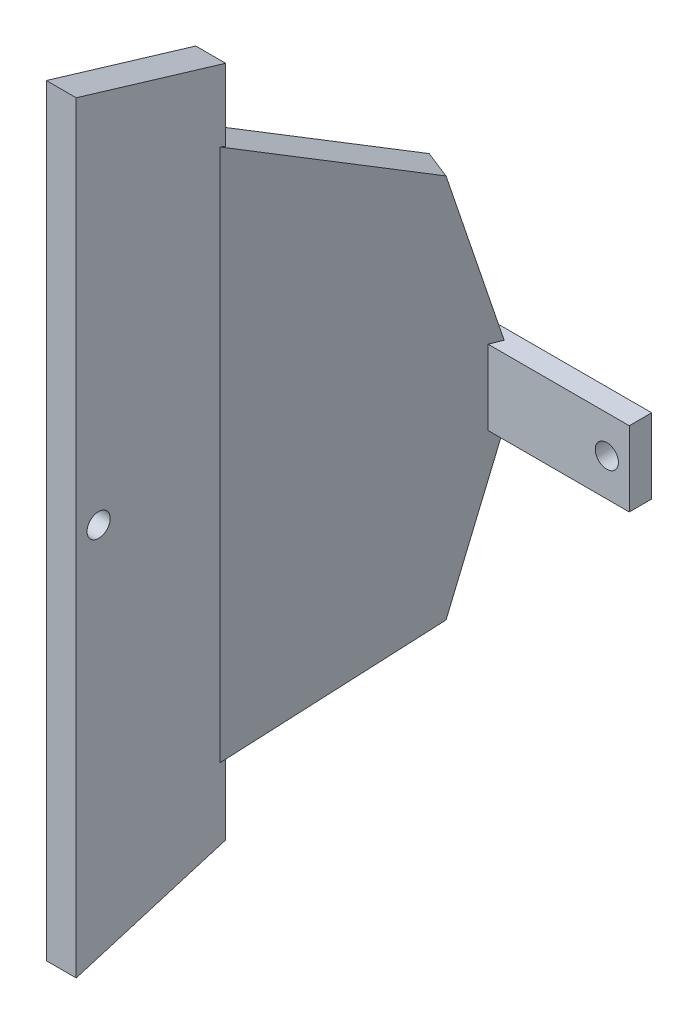
ISO-10303-21;
HEADER;
FILE_DESCRIPTION(('STEP AP214'),'2;1');
FILE_NAME('part.step','',(''),(''),'','','');
FILE_SCHEMA(('AUTOMOTIVE_DESIGN { 1 0 10303 214 1 1 1 1 }'));
ENDSEC;
DATA;
#1=APPLICATION_CONTEXT('core data for automotive mechanical design processes');
#2=APPLICATION_PROTOCOL_DEFINITION('international standard','automotive_design',2000,#1);
#3=PRODUCT_CONTEXT('',#1,'mechanical');
#4=PRODUCT('Part','Part','',(#3));
#5=PRODUCT_RELATED_PRODUCT_CATEGORY('part','',(#4));
#6=PRODUCT_DEFINITION_FORMATION('','',#4);
#7=PRODUCT_DEFINITION_CONTEXT('part definition',#1,'design');
#8=PRODUCT_DEFINITION('design','',#6,#7);
#9=PRODUCT_DEFINITION_SHAPE('','',#8);
#10=(LENGTH_UNIT() NAMED_UNIT(*) SI_UNIT(.MILLI.,.METRE.));
#11=(NAMED_UNIT(*) PLANE_ANGLE_UNIT() SI_UNIT($,.RADIAN.));
#12=(NAMED_UNIT(*) SI_UNIT($,.STERADIAN.) SOLID_ANGLE_UNIT());
#13=UNCERTAINTY_MEASURE_WITH_UNIT(LENGTH_MEASURE(1.E-05),#10,'distance_accuracy_value','');
#14=(GEOMETRIC_REPRESENTATION_CONTEXT(3) GLOBAL_UNCERTAINTY_ASSIGNED_CONTEXT((#13)) GLOBAL_UNIT_ASSIGNED_CONTEXT((#10,
#11,#12)) REPRESENTATION_CONTEXT('',''));
#15=CARTESIAN_POINT('',(0.,0.,0.));
#16=DIRECTION('',(0.,0.,1.));
#17=DIRECTION('',(1.,0.,0.));
#18=AXIS2_PLACEMENT_3D('',#15,#16,#17);
#19=CARTESIAN_POINT('',(3.,10.,-16.6970116680063));
#20=DIRECTION('',(-0.930751493440347,0.,-0.365652372422993));
#21=DIRECTION('',(-0.365652372422993,0.,0.930751493440347));
#22=AXIS2_PLACEMENT_3D('',#19,#20,#21);
#23=PLANE('',#22);
#24=DIRECTION('',(0.,1.,0.));
#25=VECTOR('',#24,1.);
#26=CARTESIAN_POINT('',(4.,10.,-19.2424662134609));
#27=LINE('',#26,#25);
#28=CARTESIAN_POINT('',(4.,-30.6769587845002,-19.2424662134609));
#29=VERTEX_POINT('',#28);
#30=CARTESIAN_POINT('',(4.,40.6769587845002,-19.2424662134609));
#31=VERTEX_POINT('',#30);
#32=EDGE_CURVE('E220',#29,#31,#27,.T.);
#33=ORIENTED_EDGE('',*,*,#32,.F.);
#34=DIRECTION('',(-0.336346820980109,-0.392260755058008,0.856155544313004));
#35=VECTOR('',#34,1.);
#36=CARTESIAN_POINT('',(12.5290917392234,-20.73,-40.9528815496659));
#37=LINE('',#36,#35);
#38=CARTESIAN_POINT('',(12.5290917392234,-20.73,-40.9528815496659));
#39=VERTEX_POINT('',#38);
#40=EDGE_CURVE('E235',#39,#29,#37,.T.);
#41=ORIENTED_EDGE('',*,*,#40,.F.);
#42=DIRECTION('',(-0.101660253156479,-0.960574034644356,0.25877155348922));
#43=VECTOR('',#42,1.);
#44=CARTESIAN_POINT('',(14.7230059737614,0.,-46.537390510308));
#45=LINE('',#44,#43);
#46=CARTESIAN_POINT('',(14.7230059737614,0.,-46.537390510308));
#47=VERTEX_POINT('',#46);
#48=EDGE_CURVE('E232',#47,#39,#45,.T.);
#49=ORIENTED_EDGE('',*,*,#48,.F.);
#50=DIRECTION('',(-0.365652372422993,0.,0.930751493440347));
#51=VECTOR('',#50,1.);
#52=CARTESIAN_POINT('',(-3.08362386049275,0.,-1.21142365947929));
#53=LINE('',#52,#51);
#54=CARTESIAN_POINT('',(14.1190311304261,0.,-45.));
#55=VERTEX_POINT('',#54);
#56=EDGE_CURVE('E67',#47,#55,#53,.T.);
#57=ORIENTED_EDGE('',*,*,#56,.T.);
#58=DIRECTION('',(0.,-1.,0.));
#59=VECTOR('',#58,1.);
#60=CARTESIAN_POINT('',(14.1190311304261,10.,-45.));
#61=LINE('',#60,#59);
#62=CARTESIAN_POINT('',(14.1190311304261,10.,-45.));
#63=VERTEX_POINT('',#62);
#64=EDGE_CURVE('E286',#63,#55,#61,.T.);
#65=ORIENTED_EDGE('',*,*,#64,.F.);
#66=DIRECTION('',(-0.365652372422993,0.,0.930751493440347));
#67=VECTOR('',#66,1.);
#68=CARTESIAN_POINT('',(-3.08362386049275,10.,-1.21142365947929));
#69=LINE('',#68,#67);
#70=CARTESIAN_POINT('',(14.7230059737614,10.,-46.537390510308));
#71=VERTEX_POINT('',#70);
#72=EDGE_CURVE('E100',#71,#63,#69,.T.);
#73=ORIENTED_EDGE('',*,*,#72,.F.);
#74=DIRECTION('',(0.101660253156479,-0.960574034644356,-0.25877155348922));
#75=VECTOR('',#74,1.);
#76=CARTESIAN_POINT('',(12.5290917392234,30.73,-40.9528815496659));
#77=LINE('',#76,#75);
#78=CARTESIAN_POINT('',(12.5290917392234,30.73,-40.9528815496659));
#79=VERTEX_POINT('',#78);
#80=EDGE_CURVE('E228',#79,#71,#77,.T.);
#81=ORIENTED_EDGE('',*,*,#80,.F.);
#82=DIRECTION('',(0.336346820980108,-0.392260755058008,-0.856155544313004));
#83=VECTOR('',#82,1.);
#84=CARTESIAN_POINT('',(3.72300597376139,41.,-18.537390510308));
#85=LINE('',#84,#83);
#86=EDGE_CURVE('E226',#31,#79,#85,.T.);
#87=ORIENTED_EDGE('',*,*,#86,.F.);
#88=EDGE_LOOP('',(#33,#41,#49,#57,#65,#73,#81,#87));
#89=FACE_BOUND('',#88,.T.);
#90=ADVANCED_FACE('F59',(#89),#23,.F.);
#91=CARTESIAN_POINT('',(12.5290917392234,-20.73,-40.9528815496659));
#92=DIRECTION('',(0.143431075695395,-0.91985406453487,-0.365097283588279));
#93=DIRECTION('',(0.,0.368911716874737,-0.929464439961279));
#94=AXIS2_PLACEMENT_3D('',#91,#92,#93);
#95=PLANE('',#94);
#96=ORIENTED_EDGE('',*,*,#40,.T.);
#97=DIRECTION('',(0.,0.368911716874737,-0.929464439961279));
#98=VECTOR('',#97,1.);
#99=CARTESIAN_POINT('',(4.,-21.8789276132558,-41.4088999191139));
#100=LINE('',#99,#98);
#101=CARTESIAN_POINT('',(4.,-30.3762876907309,-19.9999999999999));
#102=VERTEX_POINT('',#101);
#103=EDGE_CURVE('E222',#29,#102,#100,.T.);
#104=ORIENTED_EDGE('',*,*,#103,.T.);
#105=DIRECTION('',(0.988060500360884,0.154066374094409,0.));
#106=VECTOR('',#105,1.);
#107=CARTESIAN_POINT('',(13.7950658587542,-28.8489619041794,-20.));
#108=LINE('',#107,#106);
#109=CARTESIAN_POINT('',(0.,-31.,-20.));
#110=VERTEX_POINT('',#109);
#111=EDGE_CURVE('E218',#110,#102,#108,.T.);
#112=ORIENTED_EDGE('',*,*,#111,.F.);
#113=DIRECTION('',(-0.336346820980109,-0.392260755058008,0.856155544313004));
#114=VECTOR('',#113,1.);
#115=CARTESIAN_POINT('',(8.80608576546203,-20.73,-42.4154910393579));
#116=LINE('',#115,#114);
#117=CARTESIAN_POINT('',(8.80608576546203,-20.73,-42.4154910393579));
#118=VERTEX_POINT('',#117);
#119=EDGE_CURVE('E229',#118,#110,#116,.T.);
#120=ORIENTED_EDGE('',*,*,#119,.F.);
#121=DIRECTION('',(-0.930751493440347,0.,-0.365652372422993));
#122=VECTOR('',#121,1.);
#123=CARTESIAN_POINT('',(12.5290917392234,-20.73,-40.9528815496659));
#124=LINE('',#123,#122);
#125=EDGE_CURVE('E249',#39,#118,#124,.T.);
#126=ORIENTED_EDGE('',*,*,#125,.F.);
#127=EDGE_LOOP('',(#96,#104,#112,#120,#126));
#128=FACE_BOUND('',#127,.T.);
#129=ADVANCED_FACE('F330',(#128),#95,.T.);
#130=CARTESIAN_POINT('',(3.72300597376139,41.,-18.537390510308));
#131=DIRECTION('',(0.143431075695395,0.91985406453487,-0.365097283588279));
#132=DIRECTION('',(0.,0.368911716874737,0.929464439961279));
#133=AXIS2_PLACEMENT_3D('',#130,#131,#132);
#134=PLANE('',#133);
#135=DIRECTION('',(-0.988060500360885,0.154066374094409,0.));
#136=VECTOR('',#135,1.);
#137=CARTESIAN_POINT('',(3.63463503745169,40.4332583468602,-20.));
#138=LINE('',#137,#136);
#139=CARTESIAN_POINT('',(4.,40.3762876907309,-20.));
#140=VERTEX_POINT('',#139);
#141=CARTESIAN_POINT('',(0.,41.,-20.));
#142=VERTEX_POINT('',#141);
#143=EDGE_CURVE('E211',#140,#142,#138,.T.);
#144=ORIENTED_EDGE('',*,*,#143,.F.);
#145=DIRECTION('',(0.,0.368911716874737,0.929464439961279));
#146=VECTOR('',#145,1.);
#147=CARTESIAN_POINT('',(4.,40.9626869899888,-18.5225806843554));
#148=LINE('',#147,#146);
#149=EDGE_CURVE('E12',#140,#31,#148,.T.);
#150=ORIENTED_EDGE('',*,*,#149,.T.);
#151=ORIENTED_EDGE('',*,*,#86,.T.);
#152=DIRECTION('',(-0.930751493440347,0.,-0.365652372422993));
#153=VECTOR('',#152,1.);
#154=CARTESIAN_POINT('',(12.5290917392234,30.73,-40.9528815496659));
#155=LINE('',#154,#153);
#156=CARTESIAN_POINT('',(8.80608576546203,30.73,-42.4154910393579));
#157=VERTEX_POINT('',#156);
#158=EDGE_CURVE('E238',#79,#157,#155,.T.);
#159=ORIENTED_EDGE('',*,*,#158,.T.);
#160=DIRECTION('',(0.336346820980108,-0.392260755058008,-0.856155544313004));
#161=VECTOR('',#160,1.);
#162=CARTESIAN_POINT('',(0.,41.,-20.));
#163=LINE('',#162,#161);
#164=EDGE_CURVE('E225',#142,#157,#163,.T.);
#165=ORIENTED_EDGE('',*,*,#164,.F.);
#166=EDGE_LOOP('',(#144,#150,#151,#159,#165));
#167=FACE_BOUND('',#166,.T.);
#168=ADVANCED_FACE('F316',(#167),#134,.T.);
#169=CARTESIAN_POINT('',(0.,10.,-20.));
#170=DIRECTION('',(1.,0.,0.));
#171=DIRECTION('',(0.,0.,-1.));
#172=AXIS2_PLACEMENT_3D('',#169,#170,#171);
#173=PLANE('',#172);
#174=CARTESIAN_POINT('',(0.,5.,-3.));
#175=DIRECTION('',(-1.,0.,0.));
#176=DIRECTION('',(0.,0.,1.));
#177=AXIS2_PLACEMENT_3D('',#174,#175,#176);
#178=CIRCLE('',#177,1.55);
#179=CARTESIAN_POINT('',(0.,5.,-1.45));
#180=VERTEX_POINT('',#179);
#181=EDGE_CURVE('E263',#180,#180,#178,.T.);
#182=ORIENTED_EDGE('',*,*,#181,.F.);
#183=EDGE_LOOP('',(#182));
#184=FACE_BOUND('',#183,.T.);
#185=DIRECTION('',(0.,-1.,0.));
#186=VECTOR('',#185,1.);
#187=CARTESIAN_POINT('',(0.,10.,-20.));
#188=LINE('',#187,#186);
#189=EDGE_CURVE('E273',#142,#110,#188,.T.);
#190=ORIENTED_EDGE('',*,*,#189,.T.);
#191=DIRECTION('',(0.,-1.,0.));
#192=VECTOR('',#191,1.);
#193=CARTESIAN_POINT('',(0.,41.,-20.));
#194=LINE('',#193,#192);
#195=CARTESIAN_POINT('',(0.,-40.,-20.));
#196=VERTEX_POINT('',#195);
#197=EDGE_CURVE('E197',#110,#196,#194,.T.);
#198=ORIENTED_EDGE('',*,*,#197,.T.);
#199=DIRECTION('',(0.,-0.287347885566345,0.957826285221151));
#200=VECTOR('',#199,1.);
#201=CARTESIAN_POINT('',(0.,-40.,-20.));
#202=LINE('',#201,#200);
#203=CARTESIAN_POINT('',(0.,-46.,0.));
#204=VERTEX_POINT('',#203);
#205=EDGE_CURVE('E205',#196,#204,#202,.T.);
#206=ORIENTED_EDGE('',*,*,#205,.T.);
#207=DIRECTION('',(0.,-1.,0.));
#208=VECTOR('',#207,1.);
#209=CARTESIAN_POINT('',(0.,10.,0.));
#210=LINE('',#209,#208);
#211=CARTESIAN_POINT('',(0.,56.,0.));
#212=VERTEX_POINT('',#211);
#213=EDGE_CURVE('E172',#212,#204,#210,.T.);
#214=ORIENTED_EDGE('',*,*,#213,.F.);
#215=DIRECTION('',(0.,0.287347885566345,0.957826285221152));
#216=VECTOR('',#215,1.);
#217=CARTESIAN_POINT('',(0.,50.,-20.));
#218=LINE('',#217,#216);
#219=CARTESIAN_POINT('',(0.,50.,-20.));
#220=VERTEX_POINT('',#219);
#221=EDGE_CURVE('E207',#220,#212,#218,.T.);
#222=ORIENTED_EDGE('',*,*,#221,.F.);
#223=EDGE_CURVE('E194',#220,#142,#194,.T.);
#224=ORIENTED_EDGE('',*,*,#223,.T.);
#225=EDGE_LOOP('',(#190,#198,#206,#214,#222,#224));
#226=FACE_BOUND('',#225,.T.);
#227=ADVANCED_FACE('F61',(#184,#226),#173,.F.);
#228=CARTESIAN_POINT('',(0.,10.,0.));
#229=DIRECTION('',(0.,0.,-1.));
#230=DIRECTION('',(-1.,0.,0.));
#231=AXIS2_PLACEMENT_3D('',#228,#229,#230);
#232=PLANE('',#231);
#233=ORIENTED_EDGE('',*,*,#213,.T.);
#234=DIRECTION('',(-1.,0.,0.));
#235=VECTOR('',#234,1.);
#236=CARTESIAN_POINT('',(4.,-46.,0.));
#237=LINE('',#236,#235);
#238=CARTESIAN_POINT('',(4.,-46.,0.));
#239=VERTEX_POINT('',#238);
#240=EDGE_CURVE('E167',#239,#204,#237,.T.);
#241=ORIENTED_EDGE('',*,*,#240,.F.);
#242=DIRECTION('',(0.,1.,0.));
#243=VECTOR('',#242,1.);
#244=CARTESIAN_POINT('',(4.,-46.,0.));
#245=LINE('',#244,#243);
#246=CARTESIAN_POINT('',(4.,56.,0.));
#247=VERTEX_POINT('',#246);
#248=EDGE_CURVE('E171',#239,#247,#245,.T.);
#249=ORIENTED_EDGE('',*,*,#248,.T.);
#250=DIRECTION('',(-1.,0.,0.));
#251=VECTOR('',#250,1.);
#252=CARTESIAN_POINT('',(4.,56.,0.));
#253=LINE('',#252,#251);
#254=EDGE_CURVE('E177',#247,#212,#253,.T.);
#255=ORIENTED_EDGE('',*,*,#254,.T.);
#256=EDGE_LOOP('',(#233,#241,#249,#255));
#257=FACE_BOUND('',#256,.T.);
#258=ADVANCED_FACE('F169',(#257),#232,.F.);
#259=CARTESIAN_POINT('',(14.1190311304261,10.,-45.));
#260=DIRECTION('',(0.,0.,-1.));
#261=DIRECTION('',(-1.,0.,0.));
#262=AXIS2_PLACEMENT_3D('',#259,#260,#261);
#263=PLANE('',#262);
#264=CARTESIAN_POINT('',(30.,5.,-45.));
#265=DIRECTION('',(0.,0.,-1.));
#266=DIRECTION('',(-1.,0.,0.));
#267=AXIS2_PLACEMENT_3D('',#264,#265,#266);
#268=CIRCLE('',#267,1.55);
#269=CARTESIAN_POINT('',(28.45,5.,-45.));
#270=VERTEX_POINT('',#269);
#271=EDGE_CURVE('E260',#270,#270,#268,.T.);
#272=ORIENTED_EDGE('',*,*,#271,.T.);
#273=EDGE_LOOP('',(#272));
#274=FACE_BOUND('',#273,.T.);
#275=DIRECTION('',(1.,0.,0.));
#276=VECTOR('',#275,1.);
#277=CARTESIAN_POINT('',(14.1190311304261,0.,-45.));
#278=LINE('',#277,#276);
#279=CARTESIAN_POINT('',(33.,0.,-45.));
#280=VERTEX_POINT('',#279);
#281=EDGE_CURVE('E266',#55,#280,#278,.T.);
#282=ORIENTED_EDGE('',*,*,#281,.T.);
#283=DIRECTION('',(0.,-1.,0.));
#284=VECTOR('',#283,1.);
#285=CARTESIAN_POINT('',(33.,10.,-45.));
#286=LINE('',#285,#284);
#287=CARTESIAN_POINT('',(33.,10.,-45.));
#288=VERTEX_POINT('',#287);
#289=EDGE_CURVE('E284',#288,#280,#286,.T.);
#290=ORIENTED_EDGE('',*,*,#289,.F.);
#291=DIRECTION('',(1.,0.,0.));
#292=VECTOR('',#291,1.);
#293=CARTESIAN_POINT('',(14.1190311304261,10.,-45.));
#294=LINE('',#293,#292);
#295=EDGE_CURVE('E267',#63,#288,#294,.T.);
#296=ORIENTED_EDGE('',*,*,#295,.F.);
#297=ORIENTED_EDGE('',*,*,#64,.T.);
#298=EDGE_LOOP('',(#282,#290,#296,#297));
#299=FACE_BOUND('',#298,.T.);
#300=ADVANCED_FACE('F298',(#274,#299),#263,.F.);
#301=CARTESIAN_POINT('',(33.,10.,-45.));
#302=DIRECTION('',(-1.,0.,0.));
#303=DIRECTION('',(0.,0.,1.));
#304=AXIS2_PLACEMENT_3D('',#301,#302,#303);
#305=PLANE('',#304);
#306=DIRECTION('',(0.,0.,-1.));
#307=VECTOR('',#306,1.);
#308=CARTESIAN_POINT('',(33.,0.,-45.));
#309=LINE('',#308,#307);
#310=CARTESIAN_POINT('',(33.,0.,-48.));
#311=VERTEX_POINT('',#310);
#312=EDGE_CURVE('E96',#280,#311,#309,.T.);
#313=ORIENTED_EDGE('',*,*,#312,.T.);
#314=DIRECTION('',(0.,-1.,0.));
#315=VECTOR('',#314,1.);
#316=CARTESIAN_POINT('',(33.,10.,-48.));
#317=LINE('',#316,#315);
#318=CARTESIAN_POINT('',(33.,10.,-48.));
#319=VERTEX_POINT('',#318);
#320=EDGE_CURVE('E282',#319,#311,#317,.T.);
#321=ORIENTED_EDGE('',*,*,#320,.F.);
#322=DIRECTION('',(0.,0.,-1.));
#323=VECTOR('',#322,1.);
#324=CARTESIAN_POINT('',(33.,10.,-45.));
#325=LINE('',#324,#323);
#326=EDGE_CURVE('E269',#288,#319,#325,.T.);
#327=ORIENTED_EDGE('',*,*,#326,.F.);
#328=ORIENTED_EDGE('',*,*,#289,.T.);
#329=EDGE_LOOP('',(#313,#321,#327,#328));
#330=FACE_BOUND('',#329,.T.);
#331=ADVANCED_FACE('F359',(#330),#305,.F.);
#332=CARTESIAN_POINT('',(33.,10.,-48.));
#333=DIRECTION('',(0.,0.,1.));
#334=DIRECTION('',(1.,0.,0.));
#335=AXIS2_PLACEMENT_3D('',#332,#333,#334);
#336=PLANE('',#335);
#337=CARTESIAN_POINT('',(30.,5.,-48.));
#338=DIRECTION('',(0.,0.,-1.));
#339=DIRECTION('',(-1.,0.,0.));
#340=AXIS2_PLACEMENT_3D('',#337,#338,#339);
#341=CIRCLE('',#340,1.55);
#342=CARTESIAN_POINT('',(28.45,5.,-48.));
#343=VERTEX_POINT('',#342);
#344=EDGE_CURVE('E257',#343,#343,#341,.T.);
#345=ORIENTED_EDGE('',*,*,#344,.F.);
#346=EDGE_LOOP('',(#345));
#347=FACE_BOUND('',#346,.T.);
#348=DIRECTION('',(-1.,0.,0.));
#349=VECTOR('',#348,1.);
#350=CARTESIAN_POINT('',(33.,0.,-48.));
#351=LINE('',#350,#349);
#352=CARTESIAN_POINT('',(11.,0.,-48.));
#353=VERTEX_POINT('',#352);
#354=EDGE_CURVE('E270',#311,#353,#351,.T.);
#355=ORIENTED_EDGE('',*,*,#354,.T.);
#356=DIRECTION('',(0.,-1.,0.));
#357=VECTOR('',#356,1.);
#358=CARTESIAN_POINT('',(11.,10.,-48.));
#359=LINE('',#358,#357);
#360=CARTESIAN_POINT('',(11.,10.,-48.));
#361=VERTEX_POINT('',#360);
#362=EDGE_CURVE('E279',#361,#353,#359,.T.);
#363=ORIENTED_EDGE('',*,*,#362,.F.);
#364=DIRECTION('',(-1.,0.,0.));
#365=VECTOR('',#364,1.);
#366=CARTESIAN_POINT('',(33.,10.,-48.));
#367=LINE('',#366,#365);
#368=EDGE_CURVE('E80',#319,#361,#367,.T.);
#369=ORIENTED_EDGE('',*,*,#368,.F.);
#370=ORIENTED_EDGE('',*,*,#320,.T.);
#371=EDGE_LOOP('',(#355,#363,#369,#370));
#372=FACE_BOUND('',#371,.T.);
#373=ADVANCED_FACE('F303',(#347,#372),#336,.F.);
#374=CARTESIAN_POINT('',(11.,10.,-48.));
#375=DIRECTION('',(0.930751493440347,0.,0.365652372422993));
#376=DIRECTION('',(0.365652372422993,0.,-0.930751493440347));
#377=AXIS2_PLACEMENT_3D('',#374,#375,#376);
#378=PLANE('',#377);
#379=ORIENTED_EDGE('',*,*,#362,.T.);
#380=DIRECTION('',(-0.101660253156479,-0.960574034644356,0.25877155348922));
#381=VECTOR('',#380,1.);
#382=CARTESIAN_POINT('',(11.,0.,-48.));
#383=LINE('',#382,#381);
#384=EDGE_CURVE('E244',#353,#118,#383,.T.);
#385=ORIENTED_EDGE('',*,*,#384,.T.);
#386=ORIENTED_EDGE('',*,*,#119,.T.);
#387=ORIENTED_EDGE('',*,*,#189,.F.);
#388=ORIENTED_EDGE('',*,*,#164,.T.);
#389=DIRECTION('',(0.101660253156479,-0.960574034644356,-0.25877155348922));
#390=VECTOR('',#389,1.);
#391=CARTESIAN_POINT('',(8.80608576546203,30.73,-42.4154910393579));
#392=LINE('',#391,#390);
#393=EDGE_CURVE('E241',#157,#361,#392,.T.);
#394=ORIENTED_EDGE('',*,*,#393,.T.);
#395=EDGE_LOOP('',(#379,#385,#386,#387,#388,#394));
#396=FACE_BOUND('',#395,.T.);
#397=ADVANCED_FACE('F305',(#396),#378,.F.);
#398=CARTESIAN_POINT('',(0.,10.,0.));
#399=DIRECTION('',(0.,1.,0.));
#400=DIRECTION('',(0.,0.,1.));
#401=AXIS2_PLACEMENT_3D('',#398,#399,#400);
#402=PLANE('',#401);
#403=DIRECTION('',(-0.930751493440347,0.,-0.365652372422993));
#404=VECTOR('',#403,1.);
#405=CARTESIAN_POINT('',(14.7230059737614,10.,-46.537390510308));
#406=LINE('',#405,#404);
#407=EDGE_CURVE('E74',#71,#361,#406,.T.);
#408=ORIENTED_EDGE('',*,*,#407,.F.);
#409=ORIENTED_EDGE('',*,*,#72,.T.);
#410=ORIENTED_EDGE('',*,*,#295,.T.);
#411=ORIENTED_EDGE('',*,*,#326,.T.);
#412=ORIENTED_EDGE('',*,*,#368,.T.);
#413=EDGE_LOOP('',(#408,#409,#410,#411,#412));
#414=FACE_BOUND('',#413,.T.);
#415=ADVANCED_FACE('F424',(#414),#402,.T.);
#416=CARTESIAN_POINT('',(0.,0.,0.));
#417=DIRECTION('',(0.,1.,0.));
#418=DIRECTION('',(0.,0.,1.));
#419=AXIS2_PLACEMENT_3D('',#416,#417,#418);
#420=PLANE('',#419);
#421=ORIENTED_EDGE('',*,*,#56,.F.);
#422=DIRECTION('',(-0.930751493440347,0.,-0.365652372422993));
#423=VECTOR('',#422,1.);
#424=CARTESIAN_POINT('',(14.7230059737614,0.,-46.537390510308));
#425=LINE('',#424,#423);
#426=EDGE_CURVE('E251',#47,#353,#425,.T.);
#427=ORIENTED_EDGE('',*,*,#426,.T.);
#428=ORIENTED_EDGE('',*,*,#354,.F.);
#429=ORIENTED_EDGE('',*,*,#312,.F.);
#430=ORIENTED_EDGE('',*,*,#281,.F.);
#431=EDGE_LOOP('',(#421,#427,#428,#429,#430));
#432=FACE_BOUND('',#431,.T.);
#433=ADVANCED_FACE('F300',(#432),#420,.F.);
#434=CARTESIAN_POINT('',(10.,5.,-3.));
#435=DIRECTION('',(-1.,0.,0.));
#436=DIRECTION('',(0.,0.,1.));
#437=AXIS2_PLACEMENT_3D('',#434,#435,#436);
#438=CYLINDRICAL_SURFACE('',#437,1.55);
#439=ORIENTED_EDGE('',*,*,#181,.T.);
#440=EDGE_LOOP('',(#439));
#441=FACE_BOUND('',#440,.T.);
#442=CARTESIAN_POINT('',(4.,5.,-3.));
#443=DIRECTION('',(-1.,0.,0.));
#444=DIRECTION('',(0.,0.,1.));
#445=AXIS2_PLACEMENT_3D('',#442,#443,#444);
#446=CIRCLE('',#445,1.55);
#447=CARTESIAN_POINT('',(4.,5.,-1.45));
#448=VERTEX_POINT('',#447);
#449=EDGE_CURVE('E200',#448,#448,#446,.F.);
#450=ORIENTED_EDGE('',*,*,#449,.T.);
#451=EDGE_LOOP('',(#450));
#452=FACE_BOUND('',#451,.T.);
#453=ADVANCED_FACE('F342',(#441,#452),#438,.F.);
#454=CARTESIAN_POINT('',(30.,5.,-38.));
#455=DIRECTION('',(0.,0.,-1.));
#456=DIRECTION('',(-1.,0.,0.));
#457=AXIS2_PLACEMENT_3D('',#454,#455,#456);
#458=CYLINDRICAL_SURFACE('',#457,1.55);
#459=ORIENTED_EDGE('',*,*,#344,.T.);
#460=EDGE_LOOP('',(#459));
#461=FACE_BOUND('',#460,.T.);
#462=ORIENTED_EDGE('',*,*,#271,.F.);
#463=EDGE_LOOP('',(#462));
#464=FACE_BOUND('',#463,.T.);
#465=ADVANCED_FACE('F334',(#461,#464),#458,.F.);
#466=CARTESIAN_POINT('',(14.7230059737614,0.,-46.537390510308));
#467=DIRECTION('',(0.351236174655635,-0.278024322617759,-0.894055717305254));
#468=DIRECTION('',(-0.930751493440347,0.,-0.365652372422993));
#469=AXIS2_PLACEMENT_3D('',#466,#467,#468);
#470=PLANE('',#469);
#471=ORIENTED_EDGE('',*,*,#384,.F.);
#472=ORIENTED_EDGE('',*,*,#426,.F.);
#473=ORIENTED_EDGE('',*,*,#48,.T.);
#474=ORIENTED_EDGE('',*,*,#125,.T.);
#475=EDGE_LOOP('',(#471,#472,#473,#474));
#476=FACE_BOUND('',#475,.T.);
#477=ADVANCED_FACE('F332',(#476),#470,.T.);
#478=CARTESIAN_POINT('',(12.5290917392234,30.73,-40.9528815496659));
#479=DIRECTION('',(0.351236174655635,0.278024322617759,-0.894055717305254));
#480=DIRECTION('',(-0.930751493440347,0.,-0.365652372422993));
#481=AXIS2_PLACEMENT_3D('',#478,#479,#480);
#482=PLANE('',#481);
#483=ORIENTED_EDGE('',*,*,#393,.F.);
#484=ORIENTED_EDGE('',*,*,#158,.F.);
#485=ORIENTED_EDGE('',*,*,#80,.T.);
#486=ORIENTED_EDGE('',*,*,#407,.T.);
#487=EDGE_LOOP('',(#483,#484,#485,#486));
#488=FACE_BOUND('',#487,.T.);
#489=ADVANCED_FACE('F311',(#488),#482,.T.);
#490=CARTESIAN_POINT('',(4.,41.,-20.));
#491=DIRECTION('',(0.,0.,-1.));
#492=DIRECTION('',(0.,1.,0.));
#493=AXIS2_PLACEMENT_3D('',#490,#491,#492);
#494=PLANE('',#493);
#495=ORIENTED_EDGE('',*,*,#197,.F.);
#496=ORIENTED_EDGE('',*,*,#111,.T.);
#497=DIRECTION('',(0.,1.,0.));
#498=VECTOR('',#497,1.);
#499=CARTESIAN_POINT('',(4.,41.,-20.));
#500=LINE('',#499,#498);
#501=CARTESIAN_POINT('',(4.,-40.,-20.));
#502=VERTEX_POINT('',#501);
#503=EDGE_CURVE('E178',#502,#102,#500,.T.);
#504=ORIENTED_EDGE('',*,*,#503,.F.);
#505=DIRECTION('',(-1.,0.,0.));
#506=VECTOR('',#505,1.);
#507=CARTESIAN_POINT('',(4.,-40.,-20.));
#508=LINE('',#507,#506);
#509=EDGE_CURVE('E193',#502,#196,#508,.T.);
#510=ORIENTED_EDGE('',*,*,#509,.T.);
#511=EDGE_LOOP('',(#495,#496,#504,#510));
#512=FACE_BOUND('',#511,.T.);
#513=ADVANCED_FACE('F328',(#512),#494,.T.);
#514=CARTESIAN_POINT('',(4.,0.,0.));
#515=DIRECTION('',(-1.,0.,0.));
#516=DIRECTION('',(0.,0.,1.));
#517=AXIS2_PLACEMENT_3D('',#514,#515,#516);
#518=PLANE('',#517);
#519=ORIENTED_EDGE('',*,*,#103,.F.);
#520=ORIENTED_EDGE('',*,*,#32,.T.);
#521=ORIENTED_EDGE('',*,*,#149,.F.);
#522=CARTESIAN_POINT('',(4.,50.,-20.));
#523=VERTEX_POINT('',#522);
#524=EDGE_CURVE('E203',#140,#523,#500,.T.);
#525=ORIENTED_EDGE('',*,*,#524,.T.);
#526=DIRECTION('',(0.,0.287347885566345,0.957826285221152));
#527=VECTOR('',#526,1.);
#528=CARTESIAN_POINT('',(4.,50.,-20.));
#529=LINE('',#528,#527);
#530=EDGE_CURVE('E187',#523,#247,#529,.T.);
#531=ORIENTED_EDGE('',*,*,#530,.T.);
#532=ORIENTED_EDGE('',*,*,#248,.F.);
#533=DIRECTION('',(0.,-0.287347885566345,0.957826285221151));
#534=VECTOR('',#533,1.);
#535=CARTESIAN_POINT('',(4.,-40.,-20.));
#536=LINE('',#535,#534);
#537=EDGE_CURVE('E185',#502,#239,#536,.T.);
#538=ORIENTED_EDGE('',*,*,#537,.F.);
#539=ORIENTED_EDGE('',*,*,#503,.T.);
#540=EDGE_LOOP('',(#519,#520,#521,#525,#531,#532,#538,#539));
#541=FACE_BOUND('',#540,.T.);
#542=ORIENTED_EDGE('',*,*,#449,.F.);
#543=EDGE_LOOP('',(#542));
#544=FACE_BOUND('',#543,.T.);
#545=ADVANCED_FACE('F182',(#541,#544),#518,.F.);
#546=CARTESIAN_POINT('',(4.,-40.,-20.));
#547=DIRECTION('',(0.,-0.957826285221152,-0.287347885566345));
#548=DIRECTION('',(0.,0.287347885566345,-0.957826285221152));
#549=AXIS2_PLACEMENT_3D('',#546,#547,#548);
#550=PLANE('',#549);
#551=ORIENTED_EDGE('',*,*,#205,.F.);
#552=ORIENTED_EDGE('',*,*,#509,.F.);
#553=ORIENTED_EDGE('',*,*,#537,.T.);
#554=ORIENTED_EDGE('',*,*,#240,.T.);
#555=EDGE_LOOP('',(#551,#552,#553,#554));
#556=FACE_BOUND('',#555,.T.);
#557=ADVANCED_FACE('F191',(#556),#550,.T.);
#558=ORIENTED_EDGE('',*,*,#524,.F.);
#559=ORIENTED_EDGE('',*,*,#143,.T.);
#560=ORIENTED_EDGE('',*,*,#223,.F.);
#561=DIRECTION('',(-1.,0.,0.));
#562=VECTOR('',#561,1.);
#563=CARTESIAN_POINT('',(4.,50.,-20.));
#564=LINE('',#563,#562);
#565=EDGE_CURVE('E212',#523,#220,#564,.T.);
#566=ORIENTED_EDGE('',*,*,#565,.F.);
#567=EDGE_LOOP('',(#558,#559,#560,#566));
#568=FACE_BOUND('',#567,.T.);
#569=ADVANCED_FACE('F320',(#568),#494,.T.);
#570=CARTESIAN_POINT('',(4.,50.,-20.));
#571=DIRECTION('',(0.,-0.957826285221152,0.287347885566345));
#572=DIRECTION('',(0.,-0.287347885566345,-0.957826285221152));
#573=AXIS2_PLACEMENT_3D('',#570,#571,#572);
#574=PLANE('',#573);
#575=ORIENTED_EDGE('',*,*,#221,.T.);
#576=ORIENTED_EDGE('',*,*,#254,.F.);
#577=ORIENTED_EDGE('',*,*,#530,.F.);
#578=ORIENTED_EDGE('',*,*,#565,.T.);
#579=EDGE_LOOP('',(#575,#576,#577,#578));
#580=FACE_BOUND('',#579,.T.);
#581=ADVANCED_FACE('F323',(#580),#574,.F.);
#582=CLOSED_SHELL('',(#90,#129,#168,#227,#258,#300,#331,#373,#397,#415,#433,#453,#465,#477,#489,
#513,#545,#557,#569,#581));
#583=MANIFOLD_SOLID_BREP('B2',#582);
#584=ADVANCED_BREP_SHAPE_REPRESENTATION('',(#18,#583),#14);
#585=SHAPE_DEFINITION_REPRESENTATION(#9,#584);
ENDSEC;
END-ISO-10303-21;
